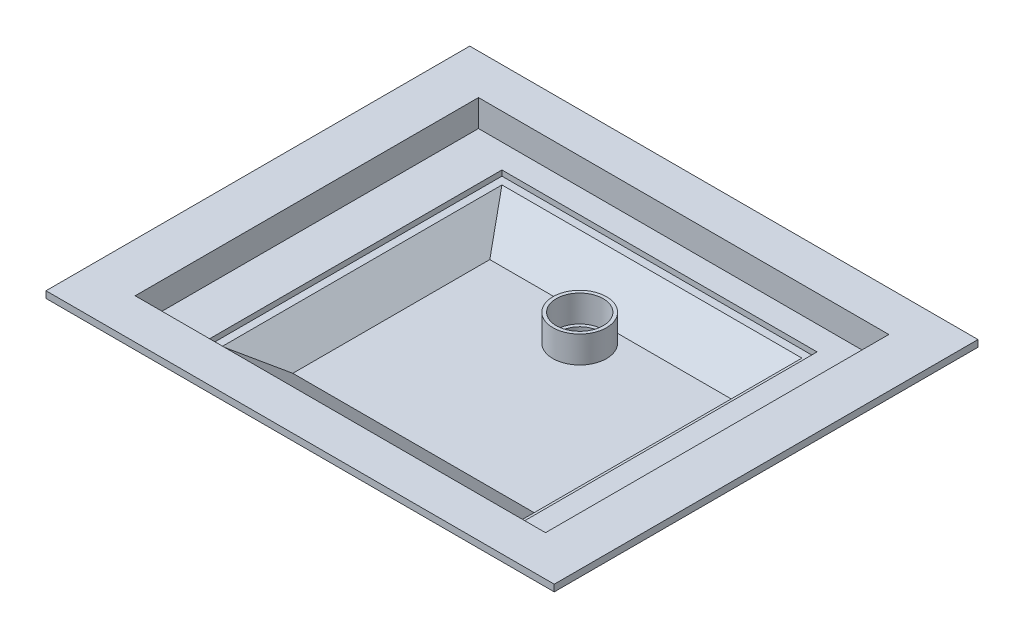
ISO-10303-21;
HEADER;
FILE_DESCRIPTION(('STEP AP214'),'2;1');
FILE_NAME('part.step','',(''),(''),'','','');
FILE_SCHEMA(('AUTOMOTIVE_DESIGN { 1 0 10303 214 1 1 1 1 }'));
ENDSEC;
DATA;
#1=APPLICATION_CONTEXT('core data for automotive mechanical design processes');
#2=APPLICATION_PROTOCOL_DEFINITION('international standard','automotive_design',2000,#1);
#3=PRODUCT_CONTEXT('',#1,'mechanical');
#4=PRODUCT('Part','Part','',(#3));
#5=PRODUCT_RELATED_PRODUCT_CATEGORY('part','',(#4));
#6=PRODUCT_DEFINITION_FORMATION('','',#4);
#7=PRODUCT_DEFINITION_CONTEXT('part definition',#1,'design');
#8=PRODUCT_DEFINITION('design','',#6,#7);
#9=PRODUCT_DEFINITION_SHAPE('','',#8);
#10=(LENGTH_UNIT() NAMED_UNIT(*) SI_UNIT(.MILLI.,.METRE.));
#11=(NAMED_UNIT(*) PLANE_ANGLE_UNIT() SI_UNIT($,.RADIAN.));
#12=(NAMED_UNIT(*) SI_UNIT($,.STERADIAN.) SOLID_ANGLE_UNIT());
#13=UNCERTAINTY_MEASURE_WITH_UNIT(LENGTH_MEASURE(1.E-05),#10,'distance_accuracy_value','');
#14=(GEOMETRIC_REPRESENTATION_CONTEXT(3) GLOBAL_UNCERTAINTY_ASSIGNED_CONTEXT((#13)) GLOBAL_UNIT_ASSIGNED_CONTEXT((#10,
#11,#12)) REPRESENTATION_CONTEXT('',''));
#15=CARTESIAN_POINT('',(0.,0.,0.));
#16=DIRECTION('',(0.,0.,1.));
#17=DIRECTION('',(1.,0.,0.));
#18=AXIS2_PLACEMENT_3D('',#15,#16,#17);
#19=CARTESIAN_POINT('',(-90.0000000000007,-21.8431457505076,-110.));
#20=DIRECTION('',(0.,-1.,0.));
#21=DIRECTION('',(1.,0.,0.));
#22=AXIS2_PLACEMENT_3D('',#19,#20,#21);
#23=PLANE('',#22);
#24=CARTESIAN_POINT('',(-2.49999999999914,-21.8431457505076,-53.));
#25=DIRECTION('',(0.,-1.,0.));
#26=DIRECTION('',(1.,0.,0.));
#27=AXIS2_PLACEMENT_3D('',#24,#25,#26);
#28=CIRCLE('',#27,15.);
#29=CARTESIAN_POINT('',(12.5000000000009,-21.8431457505076,-53.));
#30=VERTEX_POINT('',#29);
#31=EDGE_CURVE('E352',#30,#30,#28,.T.);
#32=ORIENTED_EDGE('',*,*,#31,.T.);
#33=EDGE_LOOP('',(#32));
#34=FACE_BOUND('',#33,.T.);
#35=CARTESIAN_POINT('',(-2.49999999999915,-21.8431457505075,-53.));
#36=DIRECTION('',(0.,1.,0.));
#37=DIRECTION('',(-1.,0.,0.));
#38=AXIS2_PLACEMENT_3D('',#35,#36,#37);
#39=CIRCLE('',#38,17.5);
#40=CARTESIAN_POINT('',(-19.9999999999991,-21.8431457505075,-53.));
#41=VERTEX_POINT('',#40);
#42=EDGE_CURVE('E364',#41,#41,#39,.T.);
#43=ORIENTED_EDGE('',*,*,#42,.T.);
#44=EDGE_LOOP('',(#43));
#45=FACE_BOUND('',#44,.T.);
#46=ADVANCED_FACE('F43',(#34,#45),#23,.F.);
#47=CARTESIAN_POINT('',(-111.843145750508,0.,-110.));
#48=DIRECTION('',(-0.707106781186557,-0.707106781186538,0.));
#49=DIRECTION('',(0.707106781186538,-0.707106781186557,0.));
#50=AXIS2_PLACEMENT_3D('',#47,#48,#49);
#51=PLANE('',#50);
#52=DIRECTION('',(-0.499999999999987,0.500000000000001,-0.707106781186556));
#53=VECTOR('',#52,1.);
#54=CARTESIAN_POINT('',(-113.257859312881,1.41471356237305,-106.340707106781));
#55=LINE('',#54,#53);
#56=CARTESIAN_POINT('',(-90.0000000000007,-21.8431457505076,-73.4491270347397));
#57=VERTEX_POINT('',#56);
#58=CARTESIAN_POINT('',(-111.843145750508,0.,-104.34));
#59=VERTEX_POINT('',#58);
#60=EDGE_CURVE('E154',#57,#59,#55,.T.);
#61=ORIENTED_EDGE('',*,*,#60,.T.);
#62=DIRECTION('',(0.,0.,1.));
#63=VECTOR('',#62,1.);
#64=CARTESIAN_POINT('',(-111.843145750508,0.,-110.));
#65=LINE('',#64,#63);
#66=CARTESIAN_POINT('',(-111.843145750508,0.,104.34));
#67=VERTEX_POINT('',#66);
#68=EDGE_CURVE('E51',#59,#67,#65,.T.);
#69=ORIENTED_EDGE('',*,*,#68,.T.);
#70=DIRECTION('',(0.499999999999997,-0.50000000000001,-0.707106781186543));
#71=VECTOR('',#70,1.);
#72=CARTESIAN_POINT('',(-120.824234064114,8.98108831360659,117.041176897973));
#73=LINE('',#72,#71);
#74=CARTESIAN_POINT('',(-90.0000000000007,-21.8431457505076,73.449127034741));
#75=VERTEX_POINT('',#74);
#76=EDGE_CURVE('E151',#67,#75,#73,.T.);
#77=ORIENTED_EDGE('',*,*,#76,.T.);
#78=DIRECTION('',(0.,0.,1.));
#79=VECTOR('',#78,1.);
#80=CARTESIAN_POINT('',(-90.0000000000007,-21.8431457505076,-110.));
#81=LINE('',#80,#79);
#82=EDGE_CURVE('E146',#57,#75,#81,.T.);
#83=ORIENTED_EDGE('',*,*,#82,.F.);
#84=EDGE_LOOP('',(#61,#69,#77,#83));
#85=FACE_BOUND('',#84,.T.);
#86=ADVANCED_FACE('F45',(#85),#51,.F.);
#87=CARTESIAN_POINT('',(-2.49999999999915,-21.8431457505075,-53.));
#88=DIRECTION('',(0.,-1.,0.));
#89=DIRECTION('',(1.,0.,0.));
#90=AXIS2_PLACEMENT_3D('',#87,#88,#89);
#91=CIRCLE('',#90,20.);
#92=CARTESIAN_POINT('',(17.5000000000009,-21.8431457505075,-53.));
#93=VERTEX_POINT('',#92);
#94=EDGE_CURVE('E12',#93,#93,#91,.F.);
#95=ORIENTED_EDGE('',*,*,#94,.F.);
#96=EDGE_LOOP('',(#95));
#97=FACE_BOUND('',#96,.T.);
#98=DIRECTION('',(1.,0.,0.));
#99=VECTOR('',#98,1.);
#100=CARTESIAN_POINT('',(-139.345145750508,-21.8431457505075,-73.4491270347397));
#101=LINE('',#100,#99);
#102=CARTESIAN_POINT('',(89.9999999999994,-21.8431457505075,-73.4491270347397));
#103=VERTEX_POINT('',#102);
#104=EDGE_CURVE('E58',#57,#103,#101,.T.);
#105=ORIENTED_EDGE('',*,*,#104,.F.);
#106=ORIENTED_EDGE('',*,*,#82,.T.);
#107=DIRECTION('',(1.,0.,0.));
#108=VECTOR('',#107,1.);
#109=CARTESIAN_POINT('',(-169.610644755442,-21.8431457505075,73.4491270347409));
#110=LINE('',#109,#108);
#111=CARTESIAN_POINT('',(89.9999999999994,-21.8431457505075,73.449127034741));
#112=VERTEX_POINT('',#111);
#113=EDGE_CURVE('E165',#75,#112,#110,.T.);
#114=ORIENTED_EDGE('',*,*,#113,.T.);
#115=DIRECTION('',(0.,0.,1.));
#116=VECTOR('',#115,1.);
#117=CARTESIAN_POINT('',(89.9999999999994,-21.8431457505075,-110.));
#118=LINE('',#117,#116);
#119=EDGE_CURVE('E144',#103,#112,#118,.T.);
#120=ORIENTED_EDGE('',*,*,#119,.F.);
#121=EDGE_LOOP('',(#105,#106,#114,#120));
#122=FACE_BOUND('',#121,.T.);
#123=ADVANCED_FACE('F199',(#97,#122),#23,.F.);
#124=CARTESIAN_POINT('',(89.9999999999994,-21.8431457505075,-110.));
#125=DIRECTION('',(0.707106781186538,-0.707106781186557,0.));
#126=DIRECTION('',(0.707106781186557,0.707106781186538,0.));
#127=AXIS2_PLACEMENT_3D('',#124,#125,#126);
#128=PLANE('',#127);
#129=DIRECTION('',(0.500000000000007,0.499999999999994,-0.707106781186547));
#130=VECTOR('',#129,1.);
#131=CARTESIAN_POINT('',(111.843145750508,0.,-104.34));
#132=LINE('',#131,#130);
#133=CARTESIAN_POINT('',(111.843145750508,0.,-104.34));
#134=VERTEX_POINT('',#133);
#135=EDGE_CURVE('E66',#103,#134,#132,.T.);
#136=ORIENTED_EDGE('',*,*,#135,.F.);
#137=ORIENTED_EDGE('',*,*,#119,.T.);
#138=DIRECTION('',(-0.500000000000017,-0.500000000000004,-0.707106781186533));
#139=VECTOR('',#138,1.);
#140=CARTESIAN_POINT('',(111.843145750508,0.,104.34));
#141=LINE('',#140,#139);
#142=CARTESIAN_POINT('',(111.843145750508,0.,104.34));
#143=VERTEX_POINT('',#142);
#144=EDGE_CURVE('E171',#143,#112,#141,.T.);
#145=ORIENTED_EDGE('',*,*,#144,.F.);
#146=DIRECTION('',(0.,0.,1.));
#147=VECTOR('',#146,1.);
#148=CARTESIAN_POINT('',(111.843145750508,0.,-110.));
#149=LINE('',#148,#147);
#150=EDGE_CURVE('E142',#134,#143,#149,.T.);
#151=ORIENTED_EDGE('',*,*,#150,.F.);
#152=EDGE_LOOP('',(#136,#137,#145,#151));
#153=FACE_BOUND('',#152,.T.);
#154=ADVANCED_FACE('F207',(#153),#128,.F.);
#155=CARTESIAN_POINT('',(111.843145750508,0.,-110.));
#156=DIRECTION('',(0.,-1.,0.));
#157=DIRECTION('',(0.,0.,-1.));
#158=AXIS2_PLACEMENT_3D('',#155,#156,#157);
#159=PLANE('',#158);
#160=ORIENTED_EDGE('',*,*,#68,.F.);
#161=DIRECTION('',(1.,0.,0.));
#162=VECTOR('',#161,1.);
#163=CARTESIAN_POINT('',(-117.502,0.,-104.34));
#164=LINE('',#163,#162);
#165=EDGE_CURVE('E362',#59,#134,#164,.T.);
#166=ORIENTED_EDGE('',*,*,#165,.T.);
#167=ORIENTED_EDGE('',*,*,#150,.T.);
#168=DIRECTION('',(1.,0.,0.));
#169=VECTOR('',#168,1.);
#170=CARTESIAN_POINT('',(-147.767499004934,0.,104.34));
#171=LINE('',#170,#169);
#172=EDGE_CURVE('E163',#67,#143,#171,.T.);
#173=ORIENTED_EDGE('',*,*,#172,.F.);
#174=EDGE_LOOP('',(#160,#166,#167,#173));
#175=FACE_BOUND('',#174,.T.);
#176=DIRECTION('',(1.,0.,0.));
#177=VECTOR('',#176,1.);
#178=CARTESIAN_POINT('',(111.843145750508,0.,110.));
#179=LINE('',#178,#177);
#180=CARTESIAN_POINT('',(-117.5,0.,110.));
#181=VERTEX_POINT('',#180);
#182=CARTESIAN_POINT('',(117.5,0.,110.));
#183=VERTEX_POINT('',#182);
#184=EDGE_CURVE('E182',#181,#183,#179,.T.);
#185=ORIENTED_EDGE('',*,*,#184,.T.);
#186=DIRECTION('',(0.,0.,1.));
#187=VECTOR('',#186,1.);
#188=CARTESIAN_POINT('',(117.5,0.,-110.));
#189=LINE('',#188,#187);
#190=CARTESIAN_POINT('',(117.5,0.,-110.));
#191=VERTEX_POINT('',#190);
#192=EDGE_CURVE('E134',#191,#183,#189,.T.);
#193=ORIENTED_EDGE('',*,*,#192,.F.);
#194=DIRECTION('',(1.,0.,0.));
#195=VECTOR('',#194,1.);
#196=CARTESIAN_POINT('',(-117.5,0.,-110.));
#197=LINE('',#196,#195);
#198=CARTESIAN_POINT('',(-117.5,0.,-110.));
#199=VERTEX_POINT('',#198);
#200=EDGE_CURVE('E136',#199,#191,#197,.T.);
#201=ORIENTED_EDGE('',*,*,#200,.F.);
#202=DIRECTION('',(0.,0.,1.));
#203=VECTOR('',#202,1.);
#204=CARTESIAN_POINT('',(-117.5,0.,-110.));
#205=LINE('',#204,#203);
#206=EDGE_CURVE('E126',#199,#181,#205,.T.);
#207=ORIENTED_EDGE('',*,*,#206,.T.);
#208=EDGE_LOOP('',(#185,#193,#201,#207));
#209=FACE_BOUND('',#208,.T.);
#210=ADVANCED_FACE('F168',(#175,#209),#159,.F.);
#211=CARTESIAN_POINT('',(117.5,0.,-110.));
#212=DIRECTION('',(-0.707106781186538,0.707106781186557,0.));
#213=DIRECTION('',(-0.707106781186557,-0.707106781186538,0.));
#214=AXIS2_PLACEMENT_3D('',#211,#212,#213);
#215=PLANE('',#214);
#216=DIRECTION('',(0.,0.,1.));
#217=VECTOR('',#216,1.);
#218=CARTESIAN_POINT('',(91.6568542494918,-25.8431457505075,-110.));
#219=LINE('',#218,#217);
#220=CARTESIAN_POINT('',(91.6568542494918,-25.8431457505075,-73.4522727852473));
#221=VERTEX_POINT('',#220);
#222=CARTESIAN_POINT('',(91.6568542494918,-25.8431457505075,73.4522727852489));
#223=VERTEX_POINT('',#222);
#224=EDGE_CURVE('E132',#221,#223,#219,.T.);
#225=ORIENTED_EDGE('',*,*,#224,.F.);
#226=DIRECTION('',(0.500000000000007,0.499999999999994,-0.707106781186546));
#227=VECTOR('',#226,1.);
#228=CARTESIAN_POINT('',(117.5,0.,-110.));
#229=LINE('',#228,#227);
#230=EDGE_CURVE('E113',#221,#191,#229,.T.);
#231=ORIENTED_EDGE('',*,*,#230,.T.);
#232=ORIENTED_EDGE('',*,*,#192,.T.);
#233=DIRECTION('',(-0.500000000000018,-0.500000000000004,-0.707106781186532));
#234=VECTOR('',#233,1.);
#235=CARTESIAN_POINT('',(39.7182540694787,-77.7817459305192,4.91273688396632E-12));
#236=LINE('',#235,#234);
#237=EDGE_CURVE('E118',#183,#223,#236,.T.);
#238=ORIENTED_EDGE('',*,*,#237,.T.);
#239=EDGE_LOOP('',(#225,#231,#232,#238));
#240=FACE_BOUND('',#239,.T.);
#241=ADVANCED_FACE('F187',(#240),#215,.F.);
#242=CARTESIAN_POINT('',(-91.6568542494932,-25.8431457505075,-110.));
#243=DIRECTION('',(0.,1.,0.));
#244=DIRECTION('',(-1.,0.,0.));
#245=AXIS2_PLACEMENT_3D('',#242,#243,#244);
#246=PLANE('',#245);
#247=CARTESIAN_POINT('',(-2.49999999999914,-25.8431457505075,-53.));
#248=DIRECTION('',(0.,-1.,0.));
#249=DIRECTION('',(1.,0.,0.));
#250=AXIS2_PLACEMENT_3D('',#247,#248,#249);
#251=CIRCLE('',#250,15.);
#252=CARTESIAN_POINT('',(12.5000000000009,-25.8431457505075,-53.));
#253=VERTEX_POINT('',#252);
#254=EDGE_CURVE('E351',#253,#253,#251,.T.);
#255=ORIENTED_EDGE('',*,*,#254,.F.);
#256=EDGE_LOOP('',(#255));
#257=FACE_BOUND('',#256,.T.);
#258=DIRECTION('',(0.,0.,1.));
#259=VECTOR('',#258,1.);
#260=CARTESIAN_POINT('',(-91.6568542494932,-25.8431457505075,-110.));
#261=LINE('',#260,#259);
#262=CARTESIAN_POINT('',(-91.6568542494933,-25.8431457505075,-73.4522727852473));
#263=VERTEX_POINT('',#262);
#264=CARTESIAN_POINT('',(-91.6568542494932,-25.8431457505075,73.4522727852489));
#265=VERTEX_POINT('',#264);
#266=EDGE_CURVE('E124',#263,#265,#261,.T.);
#267=ORIENTED_EDGE('',*,*,#266,.F.);
#268=DIRECTION('',(-1.,0.,0.));
#269=VECTOR('',#268,1.);
#270=CARTESIAN_POINT('',(721.343145750507,-25.8431457505075,-73.4522727852473));
#271=LINE('',#270,#269);
#272=EDGE_CURVE('E107',#221,#263,#271,.T.);
#273=ORIENTED_EDGE('',*,*,#272,.F.);
#274=ORIENTED_EDGE('',*,*,#224,.T.);
#275=DIRECTION('',(-1.,0.,0.));
#276=VECTOR('',#275,1.);
#277=CARTESIAN_POINT('',(721.343145750507,-25.8431457505075,73.4522727852489));
#278=LINE('',#277,#276);
#279=EDGE_CURVE('E128',#223,#265,#278,.T.);
#280=ORIENTED_EDGE('',*,*,#279,.T.);
#281=EDGE_LOOP('',(#267,#273,#274,#280));
#282=FACE_BOUND('',#281,.T.);
#283=ADVANCED_FACE('F131',(#257,#282),#246,.F.);
#284=CARTESIAN_POINT('',(-117.5,0.,-110.));
#285=DIRECTION('',(0.707106781186557,0.707106781186538,0.));
#286=DIRECTION('',(-0.707106781186538,0.707106781186557,0.));
#287=AXIS2_PLACEMENT_3D('',#284,#285,#286);
#288=PLANE('',#287);
#289=ORIENTED_EDGE('',*,*,#206,.F.);
#290=DIRECTION('',(-0.499999999999987,0.500000000000001,-0.707106781186556));
#291=VECTOR('',#290,1.);
#292=CARTESIAN_POINT('',(-117.5,0.,-110.));
#293=LINE('',#292,#291);
#294=EDGE_CURVE('E110',#263,#199,#293,.T.);
#295=ORIENTED_EDGE('',*,*,#294,.F.);
#296=ORIENTED_EDGE('',*,*,#266,.T.);
#297=DIRECTION('',(0.499999999999998,-0.500000000000011,-0.707106781186541));
#298=VECTOR('',#297,1.);
#299=CARTESIAN_POINT('',(-117.5,0.,110.));
#300=LINE('',#299,#298);
#301=EDGE_CURVE('E166',#181,#265,#300,.T.);
#302=ORIENTED_EDGE('',*,*,#301,.F.);
#303=EDGE_LOOP('',(#289,#295,#296,#302));
#304=FACE_BOUND('',#303,.T.);
#305=ADVANCED_FACE('F122',(#304),#288,.F.);
#306=CARTESIAN_POINT('',(695.5,0.,110.));
#307=DIRECTION('',(0.,0.816496580927718,-0.577350269189638));
#308=DIRECTION('',(0.,0.577350269189638,0.816496580927718));
#309=AXIS2_PLACEMENT_3D('',#306,#307,#308);
#310=PLANE('',#309);
#311=ORIENTED_EDGE('',*,*,#184,.F.);
#312=ORIENTED_EDGE('',*,*,#301,.T.);
#313=ORIENTED_EDGE('',*,*,#279,.F.);
#314=ORIENTED_EDGE('',*,*,#237,.F.);
#315=EDGE_LOOP('',(#311,#312,#313,#314));
#316=FACE_BOUND('',#315,.T.);
#317=ADVANCED_FACE('F188',(#316),#310,.F.);
#318=CARTESIAN_POINT('',(695.5,0.,-110.));
#319=DIRECTION('',(0.,0.816496580927729,0.577350269189622));
#320=DIRECTION('',(0.,-0.577350269189622,0.816496580927729));
#321=AXIS2_PLACEMENT_3D('',#318,#319,#320);
#322=PLANE('',#321);
#323=ORIENTED_EDGE('',*,*,#200,.T.);
#324=ORIENTED_EDGE('',*,*,#230,.F.);
#325=ORIENTED_EDGE('',*,*,#272,.T.);
#326=ORIENTED_EDGE('',*,*,#294,.T.);
#327=EDGE_LOOP('',(#323,#324,#325,#326));
#328=FACE_BOUND('',#327,.T.);
#329=ADVANCED_FACE('F109',(#328),#322,.F.);
#330=CARTESIAN_POINT('',(-147.767499004934,0.,104.34));
#331=DIRECTION('',(0.,-0.816496580927718,0.577350269189637));
#332=DIRECTION('',(0.,-0.577350269189637,-0.816496580927718));
#333=AXIS2_PLACEMENT_3D('',#330,#331,#332);
#334=PLANE('',#333);
#335=ORIENTED_EDGE('',*,*,#76,.F.);
#336=ORIENTED_EDGE('',*,*,#172,.T.);
#337=ORIENTED_EDGE('',*,*,#144,.T.);
#338=ORIENTED_EDGE('',*,*,#113,.F.);
#339=EDGE_LOOP('',(#335,#336,#337,#338));
#340=FACE_BOUND('',#339,.T.);
#341=ADVANCED_FACE('F161',(#340),#334,.F.);
#342=CARTESIAN_POINT('',(-117.502,0.,-104.34));
#343=DIRECTION('',(0.,-0.816496580927729,-0.577350269189621));
#344=DIRECTION('',(0.,0.577350269189622,-0.816496580927729));
#345=AXIS2_PLACEMENT_3D('',#342,#343,#344);
#346=PLANE('',#345);
#347=ORIENTED_EDGE('',*,*,#60,.F.);
#348=ORIENTED_EDGE('',*,*,#104,.T.);
#349=ORIENTED_EDGE('',*,*,#135,.T.);
#350=ORIENTED_EDGE('',*,*,#165,.F.);
#351=EDGE_LOOP('',(#347,#348,#349,#350));
#352=FACE_BOUND('',#351,.T.);
#353=ADVANCED_FACE('F233',(#352),#346,.F.);
#354=CARTESIAN_POINT('',(-2.49999999999907,797.156854249493,-53.));
#355=DIRECTION('',(0.,-1.,0.));
#356=DIRECTION('',(1.,0.,0.));
#357=AXIS2_PLACEMENT_3D('',#354,#355,#356);
#358=CYLINDRICAL_SURFACE('',#357,15.);
#359=ORIENTED_EDGE('',*,*,#254,.T.);
#360=EDGE_LOOP('',(#359));
#361=FACE_BOUND('',#360,.T.);
#362=ORIENTED_EDGE('',*,*,#31,.F.);
#363=EDGE_LOOP('',(#362));
#364=FACE_BOUND('',#363,.T.);
#365=ADVANCED_FACE('F226',(#361,#364),#358,.F.);
#366=CARTESIAN_POINT('',(-2.49999999999915,-1.84314575050753,-53.));
#367=DIRECTION('',(0.,1.,0.));
#368=DIRECTION('',(-1.,0.,0.));
#369=AXIS2_PLACEMENT_3D('',#366,#367,#368);
#370=PLANE('',#369);
#371=CARTESIAN_POINT('',(-2.49999999999915,-1.84314575050753,-53.));
#372=DIRECTION('',(0.,1.,0.));
#373=DIRECTION('',(-1.,0.,0.));
#374=AXIS2_PLACEMENT_3D('',#371,#372,#373);
#375=CIRCLE('',#374,20.);
#376=CARTESIAN_POINT('',(-22.4999999999992,-1.84314575050753,-53.));
#377=VERTEX_POINT('',#376);
#378=EDGE_CURVE('E353',#377,#377,#375,.T.);
#379=ORIENTED_EDGE('',*,*,#378,.T.);
#380=EDGE_LOOP('',(#379));
#381=FACE_BOUND('',#380,.T.);
#382=CARTESIAN_POINT('',(-2.49999999999915,-1.84314575050753,-53.));
#383=DIRECTION('',(0.,1.,0.));
#384=DIRECTION('',(-1.,0.,0.));
#385=AXIS2_PLACEMENT_3D('',#382,#383,#384);
#386=CIRCLE('',#385,17.5);
#387=CARTESIAN_POINT('',(-19.9999999999992,-1.84314575050753,-53.));
#388=VERTEX_POINT('',#387);
#389=EDGE_CURVE('E357',#388,#388,#386,.T.);
#390=ORIENTED_EDGE('',*,*,#389,.F.);
#391=EDGE_LOOP('',(#390));
#392=FACE_BOUND('',#391,.T.);
#393=ADVANCED_FACE('F217',(#381,#392),#370,.T.);
#394=CARTESIAN_POINT('',(-2.49999999999915,-1.84314575050753,-53.));
#395=DIRECTION('',(0.,-1.,0.));
#396=DIRECTION('',(1.,0.,0.));
#397=AXIS2_PLACEMENT_3D('',#394,#395,#396);
#398=CYLINDRICAL_SURFACE('',#397,20.);
#399=ORIENTED_EDGE('',*,*,#378,.F.);
#400=EDGE_LOOP('',(#399));
#401=FACE_BOUND('',#400,.T.);
#402=ORIENTED_EDGE('',*,*,#94,.T.);
#403=EDGE_LOOP('',(#402));
#404=FACE_BOUND('',#403,.T.);
#405=ADVANCED_FACE('F214',(#401,#404),#398,.T.);
#406=CARTESIAN_POINT('',(-2.49999999999915,-1.84314575050753,-53.));
#407=DIRECTION('',(0.,-1.,0.));
#408=DIRECTION('',(1.,0.,0.));
#409=AXIS2_PLACEMENT_3D('',#406,#407,#408);
#410=CYLINDRICAL_SURFACE('',#409,17.5);
#411=ORIENTED_EDGE('',*,*,#389,.T.);
#412=EDGE_LOOP('',(#411));
#413=FACE_BOUND('',#412,.T.);
#414=ORIENTED_EDGE('',*,*,#42,.F.);
#415=EDGE_LOOP('',(#414));
#416=FACE_BOUND('',#415,.T.);
#417=ADVANCED_FACE('F216',(#413,#416),#410,.F.);
#418=CLOSED_SHELL('',(#46,#86,#123,#154,#210,#241,#283,#305,#317,#329,#341,#353,#365,#393,#405,#417));
#419=MANIFOLD_SOLID_BREP('B2',#418);
#420=CARTESIAN_POINT('',(157.,24.,132.));
#421=DIRECTION('',(-1.,0.,0.));
#422=DIRECTION('',(0.,0.,1.));
#423=AXIS2_PLACEMENT_3D('',#420,#421,#422);
#424=PLANE('',#423);
#425=DIRECTION('',(0.,0.,-1.));
#426=VECTOR('',#425,1.);
#427=CARTESIAN_POINT('',(157.,19.,-132.));
#428=LINE('',#427,#426);
#429=CARTESIAN_POINT('',(157.,19.,132.));
#430=VERTEX_POINT('',#429);
#431=CARTESIAN_POINT('',(157.,19.,-132.));
#432=VERTEX_POINT('',#431);
#433=EDGE_CURVE('E501',#430,#432,#428,.T.);
#434=ORIENTED_EDGE('',*,*,#433,.F.);
#435=DIRECTION('',(0.,-1.,0.));
#436=VECTOR('',#435,1.);
#437=CARTESIAN_POINT('',(157.,24.,132.));
#438=LINE('',#437,#436);
#439=CARTESIAN_POINT('',(157.,0.,132.));
#440=VERTEX_POINT('',#439);
#441=EDGE_CURVE('E488',#430,#440,#438,.T.);
#442=ORIENTED_EDGE('',*,*,#441,.T.);
#443=DIRECTION('',(0.,0.,-1.));
#444=VECTOR('',#443,1.);
#445=CARTESIAN_POINT('',(157.,0.,132.));
#446=LINE('',#445,#444);
#447=CARTESIAN_POINT('',(157.,0.,-132.));
#448=VERTEX_POINT('',#447);
#449=EDGE_CURVE('E589',#440,#448,#446,.T.);
#450=ORIENTED_EDGE('',*,*,#449,.T.);
#451=DIRECTION('',(0.,-1.,0.));
#452=VECTOR('',#451,1.);
#453=CARTESIAN_POINT('',(157.,24.,-132.));
#454=LINE('',#453,#452);
#455=EDGE_CURVE('E502',#432,#448,#454,.T.);
#456=ORIENTED_EDGE('',*,*,#455,.F.);
#457=EDGE_LOOP('',(#434,#442,#450,#456));
#458=FACE_BOUND('',#457,.T.);
#459=ADVANCED_FACE('F377',(#458),#424,.F.);
#460=CARTESIAN_POINT('',(-157.,24.,-132.));
#461=DIRECTION('',(0.,0.,1.));
#462=DIRECTION('',(1.,0.,0.));
#463=AXIS2_PLACEMENT_3D('',#460,#461,#462);
#464=PLANE('',#463);
#465=DIRECTION('',(-1.,0.,0.));
#466=VECTOR('',#465,1.);
#467=CARTESIAN_POINT('',(-157.,19.,-132.));
#468=LINE('',#467,#466);
#469=CARTESIAN_POINT('',(-157.,19.,-132.));
#470=VERTEX_POINT('',#469);
#471=EDGE_CURVE('E391',#432,#470,#468,.T.);
#472=ORIENTED_EDGE('',*,*,#471,.F.);
#473=ORIENTED_EDGE('',*,*,#455,.T.);
#474=DIRECTION('',(-1.,0.,0.));
#475=VECTOR('',#474,1.);
#476=CARTESIAN_POINT('',(-157.,0.,-132.));
#477=LINE('',#476,#475);
#478=CARTESIAN_POINT('',(-157.,0.,-132.));
#479=VERTEX_POINT('',#478);
#480=EDGE_CURVE('E597',#448,#479,#477,.T.);
#481=ORIENTED_EDGE('',*,*,#480,.T.);
#482=DIRECTION('',(0.,-1.,0.));
#483=VECTOR('',#482,1.);
#484=CARTESIAN_POINT('',(-157.,24.,-132.));
#485=LINE('',#484,#483);
#486=EDGE_CURVE('E605',#470,#479,#485,.T.);
#487=ORIENTED_EDGE('',*,*,#486,.F.);
#488=EDGE_LOOP('',(#472,#473,#481,#487));
#489=FACE_BOUND('',#488,.T.);
#490=ADVANCED_FACE('F651',(#489),#464,.F.);
#491=CARTESIAN_POINT('',(-157.,24.,132.));
#492=DIRECTION('',(1.,0.,0.));
#493=DIRECTION('',(0.,0.,-1.));
#494=AXIS2_PLACEMENT_3D('',#491,#492,#493);
#495=PLANE('',#494);
#496=DIRECTION('',(0.,0.,1.));
#497=VECTOR('',#496,1.);
#498=CARTESIAN_POINT('',(-157.,19.,-132.));
#499=LINE('',#498,#497);
#500=CARTESIAN_POINT('',(-157.,19.,132.));
#501=VERTEX_POINT('',#500);
#502=EDGE_CURVE('E399',#470,#501,#499,.T.);
#503=ORIENTED_EDGE('',*,*,#502,.F.);
#504=ORIENTED_EDGE('',*,*,#486,.T.);
#505=DIRECTION('',(0.,0.,1.));
#506=VECTOR('',#505,1.);
#507=CARTESIAN_POINT('',(-157.,0.,132.));
#508=LINE('',#507,#506);
#509=CARTESIAN_POINT('',(-157.,0.,132.));
#510=VERTEX_POINT('',#509);
#511=EDGE_CURVE('E600',#479,#510,#508,.T.);
#512=ORIENTED_EDGE('',*,*,#511,.T.);
#513=DIRECTION('',(0.,-1.,0.));
#514=VECTOR('',#513,1.);
#515=CARTESIAN_POINT('',(-157.,24.,132.));
#516=LINE('',#515,#514);
#517=EDGE_CURVE('E498',#501,#510,#516,.T.);
#518=ORIENTED_EDGE('',*,*,#517,.F.);
#519=EDGE_LOOP('',(#503,#504,#512,#518));
#520=FACE_BOUND('',#519,.T.);
#521=ADVANCED_FACE('F646',(#520),#495,.F.);
#522=CARTESIAN_POINT('',(-157.,24.,132.));
#523=DIRECTION('',(0.,0.,-1.));
#524=DIRECTION('',(-1.,0.,0.));
#525=AXIS2_PLACEMENT_3D('',#522,#523,#524);
#526=PLANE('',#525);
#527=DIRECTION('',(1.,0.,0.));
#528=VECTOR('',#527,1.);
#529=CARTESIAN_POINT('',(-157.,19.,132.));
#530=LINE('',#529,#528);
#531=EDGE_CURVE('E492',#501,#430,#530,.T.);
#532=ORIENTED_EDGE('',*,*,#531,.F.);
#533=ORIENTED_EDGE('',*,*,#517,.T.);
#534=DIRECTION('',(1.,0.,0.));
#535=VECTOR('',#534,1.);
#536=CARTESIAN_POINT('',(-157.,0.,132.));
#537=LINE('',#536,#535);
#538=EDGE_CURVE('E494',#510,#440,#537,.T.);
#539=ORIENTED_EDGE('',*,*,#538,.T.);
#540=ORIENTED_EDGE('',*,*,#441,.F.);
#541=EDGE_LOOP('',(#532,#533,#539,#540));
#542=FACE_BOUND('',#541,.T.);
#543=ADVANCED_FACE('F490',(#542),#526,.F.);
#544=CARTESIAN_POINT('',(0.,4.,0.));
#545=DIRECTION('',(0.,-1.,0.));
#546=DIRECTION('',(0.,0.,-1.));
#547=AXIS2_PLACEMENT_3D('',#544,#545,#546);
#548=PLANE('',#547);
#549=DIRECTION('',(0.,0.,-1.));
#550=VECTOR('',#549,1.);
#551=CARTESIAN_POINT('',(153.,4.,128.));
#552=LINE('',#551,#550);
#553=CARTESIAN_POINT('',(153.,4.,128.));
#554=VERTEX_POINT('',#553);
#555=CARTESIAN_POINT('',(153.,4.,-128.));
#556=VERTEX_POINT('',#555);
#557=EDGE_CURVE('E564',#554,#556,#552,.T.);
#558=ORIENTED_EDGE('',*,*,#557,.T.);
#559=DIRECTION('',(-1.,0.,0.));
#560=VECTOR('',#559,1.);
#561=CARTESIAN_POINT('',(-153.,4.,-128.));
#562=LINE('',#561,#560);
#563=CARTESIAN_POINT('',(-153.,4.,-128.));
#564=VERTEX_POINT('',#563);
#565=EDGE_CURVE('E567',#556,#564,#562,.T.);
#566=ORIENTED_EDGE('',*,*,#565,.T.);
#567=DIRECTION('',(0.,0.,1.));
#568=VECTOR('',#567,1.);
#569=CARTESIAN_POINT('',(-153.,4.,128.));
#570=LINE('',#569,#568);
#571=CARTESIAN_POINT('',(-153.,4.,128.));
#572=VERTEX_POINT('',#571);
#573=EDGE_CURVE('E571',#564,#572,#570,.T.);
#574=ORIENTED_EDGE('',*,*,#573,.T.);
#575=DIRECTION('',(1.,0.,0.));
#576=VECTOR('',#575,1.);
#577=CARTESIAN_POINT('',(-153.,4.,128.));
#578=LINE('',#577,#576);
#579=EDGE_CURVE('E574',#572,#554,#578,.T.);
#580=ORIENTED_EDGE('',*,*,#579,.T.);
#581=EDGE_LOOP('',(#558,#566,#574,#580));
#582=FACE_BOUND('',#581,.T.);
#583=DIRECTION('',(0.,0.,-1.));
#584=VECTOR('',#583,1.);
#585=CARTESIAN_POINT('',(117.5,4.,110.));
#586=LINE('',#585,#584);
#587=CARTESIAN_POINT('',(117.5,4.,110.));
#588=VERTEX_POINT('',#587);
#589=CARTESIAN_POINT('',(117.5,4.,-110.));
#590=VERTEX_POINT('',#589);
#591=EDGE_CURVE('E538',#588,#590,#586,.T.);
#592=ORIENTED_EDGE('',*,*,#591,.F.);
#593=DIRECTION('',(1.,0.,0.));
#594=VECTOR('',#593,1.);
#595=CARTESIAN_POINT('',(-117.5,4.,110.));
#596=LINE('',#595,#594);
#597=CARTESIAN_POINT('',(-117.5,4.,110.));
#598=VERTEX_POINT('',#597);
#599=EDGE_CURVE('E551',#598,#588,#596,.T.);
#600=ORIENTED_EDGE('',*,*,#599,.F.);
#601=DIRECTION('',(0.,0.,1.));
#602=VECTOR('',#601,1.);
#603=CARTESIAN_POINT('',(-117.5,4.,110.));
#604=LINE('',#603,#602);
#605=CARTESIAN_POINT('',(-117.5,4.,-110.));
#606=VERTEX_POINT('',#605);
#607=EDGE_CURVE('E549',#606,#598,#604,.T.);
#608=ORIENTED_EDGE('',*,*,#607,.F.);
#609=DIRECTION('',(-1.,0.,0.));
#610=VECTOR('',#609,1.);
#611=CARTESIAN_POINT('',(-117.5,4.,-110.));
#612=LINE('',#611,#610);
#613=EDGE_CURVE('E546',#590,#606,#612,.T.);
#614=ORIENTED_EDGE('',*,*,#613,.F.);
#615=EDGE_LOOP('',(#592,#600,#608,#614));
#616=FACE_BOUND('',#615,.T.);
#617=ADVANCED_FACE('F635',(#582,#616),#548,.F.);
#618=CARTESIAN_POINT('',(0.,24.,0.));
#619=DIRECTION('',(0.,-1.,0.));
#620=DIRECTION('',(0.,0.,-1.));
#621=AXIS2_PLACEMENT_3D('',#618,#619,#620);
#622=PLANE('',#621);
#623=DIRECTION('',(-1.,0.,0.));
#624=VECTOR('',#623,1.);
#625=CARTESIAN_POINT('',(-153.,24.,-128.));
#626=LINE('',#625,#624);
#627=CARTESIAN_POINT('',(153.,24.,-128.));
#628=VERTEX_POINT('',#627);
#629=CARTESIAN_POINT('',(-153.,24.,-128.));
#630=VERTEX_POINT('',#629);
#631=EDGE_CURVE('E579',#628,#630,#626,.T.);
#632=ORIENTED_EDGE('',*,*,#631,.F.);
#633=DIRECTION('',(0.,0.,-1.));
#634=VECTOR('',#633,1.);
#635=CARTESIAN_POINT('',(153.,24.,128.));
#636=LINE('',#635,#634);
#637=CARTESIAN_POINT('',(153.,24.,128.));
#638=VERTEX_POINT('',#637);
#639=EDGE_CURVE('E557',#638,#628,#636,.T.);
#640=ORIENTED_EDGE('',*,*,#639,.F.);
#641=DIRECTION('',(1.,0.,0.));
#642=VECTOR('',#641,1.);
#643=CARTESIAN_POINT('',(-153.,24.,128.));
#644=LINE('',#643,#642);
#645=CARTESIAN_POINT('',(-153.,24.,128.));
#646=VERTEX_POINT('',#645);
#647=EDGE_CURVE('E568',#646,#638,#644,.T.);
#648=ORIENTED_EDGE('',*,*,#647,.F.);
#649=DIRECTION('',(0.,0.,1.));
#650=VECTOR('',#649,1.);
#651=CARTESIAN_POINT('',(-153.,24.,128.));
#652=LINE('',#651,#650);
#653=EDGE_CURVE('E582',#630,#646,#652,.T.);
#654=ORIENTED_EDGE('',*,*,#653,.F.);
#655=EDGE_LOOP('',(#632,#640,#648,#654));
#656=FACE_BOUND('',#655,.T.);
#657=DIRECTION('',(0.,0.,-1.));
#658=VECTOR('',#657,1.);
#659=CARTESIAN_POINT('',(189.5,24.,-158.));
#660=LINE('',#659,#658);
#661=CARTESIAN_POINT('',(189.5,24.,158.));
#662=VERTEX_POINT('',#661);
#663=CARTESIAN_POINT('',(189.5,24.,-158.));
#664=VERTEX_POINT('',#663);
#665=EDGE_CURVE('E507',#662,#664,#660,.T.);
#666=ORIENTED_EDGE('',*,*,#665,.T.);
#667=DIRECTION('',(-1.,0.,0.));
#668=VECTOR('',#667,1.);
#669=CARTESIAN_POINT('',(-189.5,24.,-158.));
#670=LINE('',#669,#668);
#671=CARTESIAN_POINT('',(-189.5,24.,-158.));
#672=VERTEX_POINT('',#671);
#673=EDGE_CURVE('E510',#664,#672,#670,.T.);
#674=ORIENTED_EDGE('',*,*,#673,.T.);
#675=DIRECTION('',(0.,0.,1.));
#676=VECTOR('',#675,1.);
#677=CARTESIAN_POINT('',(-189.5,24.,-158.));
#678=LINE('',#677,#676);
#679=CARTESIAN_POINT('',(-189.5,24.,158.));
#680=VERTEX_POINT('',#679);
#681=EDGE_CURVE('E531',#672,#680,#678,.T.);
#682=ORIENTED_EDGE('',*,*,#681,.T.);
#683=DIRECTION('',(1.,0.,0.));
#684=VECTOR('',#683,1.);
#685=CARTESIAN_POINT('',(-189.5,24.,158.));
#686=LINE('',#685,#684);
#687=EDGE_CURVE('E519',#680,#662,#686,.T.);
#688=ORIENTED_EDGE('',*,*,#687,.T.);
#689=EDGE_LOOP('',(#666,#674,#682,#688));
#690=FACE_BOUND('',#689,.T.);
#691=ADVANCED_FACE('F637',(#656,#690),#622,.F.);
#692=CARTESIAN_POINT('',(0.,0.,0.));
#693=DIRECTION('',(0.,-1.,0.));
#694=DIRECTION('',(0.,0.,-1.));
#695=AXIS2_PLACEMENT_3D('',#692,#693,#694);
#696=PLANE('',#695);
#697=DIRECTION('',(0.,0.,1.));
#698=VECTOR('',#697,1.);
#699=CARTESIAN_POINT('',(117.5,0.,0.));
#700=LINE('',#699,#698);
#701=CARTESIAN_POINT('',(117.5,0.,-110.));
#702=VERTEX_POINT('',#701);
#703=CARTESIAN_POINT('',(117.5,0.,110.));
#704=VERTEX_POINT('',#703);
#705=EDGE_CURVE('E41',#702,#704,#700,.T.);
#706=ORIENTED_EDGE('',*,*,#705,.F.);
#707=DIRECTION('',(1.,0.,0.));
#708=VECTOR('',#707,1.);
#709=CARTESIAN_POINT('',(0.,0.,-110.));
#710=LINE('',#709,#708);
#711=CARTESIAN_POINT('',(-117.5,0.,-110.));
#712=VERTEX_POINT('',#711);
#713=EDGE_CURVE('E608',#712,#702,#710,.T.);
#714=ORIENTED_EDGE('',*,*,#713,.F.);
#715=DIRECTION('',(0.,0.,-1.));
#716=VECTOR('',#715,1.);
#717=CARTESIAN_POINT('',(-117.5,0.,0.));
#718=LINE('',#717,#716);
#719=CARTESIAN_POINT('',(-117.5,0.,110.));
#720=VERTEX_POINT('',#719);
#721=EDGE_CURVE('E610',#720,#712,#718,.T.);
#722=ORIENTED_EDGE('',*,*,#721,.F.);
#723=DIRECTION('',(-1.,0.,0.));
#724=VECTOR('',#723,1.);
#725=CARTESIAN_POINT('',(0.,0.,110.));
#726=LINE('',#725,#724);
#727=EDGE_CURVE('E384',#704,#720,#726,.T.);
#728=ORIENTED_EDGE('',*,*,#727,.F.);
#729=EDGE_LOOP('',(#706,#714,#722,#728));
#730=FACE_BOUND('',#729,.T.);
#731=ORIENTED_EDGE('',*,*,#449,.F.);
#732=ORIENTED_EDGE('',*,*,#538,.F.);
#733=ORIENTED_EDGE('',*,*,#511,.F.);
#734=ORIENTED_EDGE('',*,*,#480,.F.);
#735=EDGE_LOOP('',(#731,#732,#733,#734));
#736=FACE_BOUND('',#735,.T.);
#737=ADVANCED_FACE('F625',(#730,#736),#696,.T.);
#738=CARTESIAN_POINT('',(153.,4.,128.));
#739=DIRECTION('',(1.,0.,0.));
#740=DIRECTION('',(0.,0.,-1.));
#741=AXIS2_PLACEMENT_3D('',#738,#739,#740);
#742=PLANE('',#741);
#743=ORIENTED_EDGE('',*,*,#639,.T.);
#744=DIRECTION('',(0.,1.,0.));
#745=VECTOR('',#744,1.);
#746=CARTESIAN_POINT('',(153.,4.,-128.));
#747=LINE('',#746,#745);
#748=EDGE_CURVE('E577',#556,#628,#747,.T.);
#749=ORIENTED_EDGE('',*,*,#748,.F.);
#750=ORIENTED_EDGE('',*,*,#557,.F.);
#751=DIRECTION('',(0.,1.,0.));
#752=VECTOR('',#751,1.);
#753=CARTESIAN_POINT('',(153.,4.,128.));
#754=LINE('',#753,#752);
#755=EDGE_CURVE('E587',#554,#638,#754,.T.);
#756=ORIENTED_EDGE('',*,*,#755,.T.);
#757=EDGE_LOOP('',(#743,#749,#750,#756));
#758=FACE_BOUND('',#757,.T.);
#759=ADVANCED_FACE('F661',(#758),#742,.F.);
#760=CARTESIAN_POINT('',(-153.,4.,128.));
#761=DIRECTION('',(0.,0.,1.));
#762=DIRECTION('',(1.,0.,0.));
#763=AXIS2_PLACEMENT_3D('',#760,#761,#762);
#764=PLANE('',#763);
#765=ORIENTED_EDGE('',*,*,#647,.T.);
#766=ORIENTED_EDGE('',*,*,#755,.F.);
#767=ORIENTED_EDGE('',*,*,#579,.F.);
#768=DIRECTION('',(0.,1.,0.));
#769=VECTOR('',#768,1.);
#770=CARTESIAN_POINT('',(-153.,4.,128.));
#771=LINE('',#770,#769);
#772=EDGE_CURVE('E590',#572,#646,#771,.T.);
#773=ORIENTED_EDGE('',*,*,#772,.T.);
#774=EDGE_LOOP('',(#765,#766,#767,#773));
#775=FACE_BOUND('',#774,.T.);
#776=ADVANCED_FACE('F665',(#775),#764,.F.);
#777=CARTESIAN_POINT('',(-153.,4.,128.));
#778=DIRECTION('',(-1.,0.,0.));
#779=DIRECTION('',(0.,0.,1.));
#780=AXIS2_PLACEMENT_3D('',#777,#778,#779);
#781=PLANE('',#780);
#782=ORIENTED_EDGE('',*,*,#653,.T.);
#783=ORIENTED_EDGE('',*,*,#772,.F.);
#784=ORIENTED_EDGE('',*,*,#573,.F.);
#785=DIRECTION('',(0.,1.,0.));
#786=VECTOR('',#785,1.);
#787=CARTESIAN_POINT('',(-153.,4.,-128.));
#788=LINE('',#787,#786);
#789=EDGE_CURVE('E592',#564,#630,#788,.T.);
#790=ORIENTED_EDGE('',*,*,#789,.T.);
#791=EDGE_LOOP('',(#782,#783,#784,#790));
#792=FACE_BOUND('',#791,.T.);
#793=ADVANCED_FACE('F670',(#792),#781,.F.);
#794=CARTESIAN_POINT('',(-153.,4.,-128.));
#795=DIRECTION('',(0.,0.,-1.));
#796=DIRECTION('',(-1.,0.,0.));
#797=AXIS2_PLACEMENT_3D('',#794,#795,#796);
#798=PLANE('',#797);
#799=ORIENTED_EDGE('',*,*,#631,.T.);
#800=ORIENTED_EDGE('',*,*,#789,.F.);
#801=ORIENTED_EDGE('',*,*,#565,.F.);
#802=ORIENTED_EDGE('',*,*,#748,.T.);
#803=EDGE_LOOP('',(#799,#800,#801,#802));
#804=FACE_BOUND('',#803,.T.);
#805=ADVANCED_FACE('F667',(#804),#798,.F.);
#806=CARTESIAN_POINT('',(117.5,-16.,110.));
#807=DIRECTION('',(1.,0.,0.));
#808=DIRECTION('',(0.,0.,-1.));
#809=AXIS2_PLACEMENT_3D('',#806,#807,#808);
#810=PLANE('',#809);
#811=ORIENTED_EDGE('',*,*,#705,.T.);
#812=DIRECTION('',(0.,1.,0.));
#813=VECTOR('',#812,1.);
#814=CARTESIAN_POINT('',(117.5,-16.,110.));
#815=LINE('',#814,#813);
#816=EDGE_CURVE('E555',#704,#588,#815,.T.);
#817=ORIENTED_EDGE('',*,*,#816,.T.);
#818=ORIENTED_EDGE('',*,*,#591,.T.);
#819=DIRECTION('',(0.,1.,0.));
#820=VECTOR('',#819,1.);
#821=CARTESIAN_POINT('',(117.5,-16.,-110.));
#822=LINE('',#821,#820);
#823=EDGE_CURVE('E554',#702,#590,#822,.T.);
#824=ORIENTED_EDGE('',*,*,#823,.F.);
#825=EDGE_LOOP('',(#811,#817,#818,#824));
#826=FACE_BOUND('',#825,.T.);
#827=ADVANCED_FACE('F631',(#826),#810,.F.);
#828=CARTESIAN_POINT('',(-117.5,-16.,110.));
#829=DIRECTION('',(0.,0.,1.));
#830=DIRECTION('',(1.,0.,0.));
#831=AXIS2_PLACEMENT_3D('',#828,#829,#830);
#832=PLANE('',#831);
#833=ORIENTED_EDGE('',*,*,#727,.T.);
#834=DIRECTION('',(0.,1.,0.));
#835=VECTOR('',#834,1.);
#836=CARTESIAN_POINT('',(-117.5,-16.,110.));
#837=LINE('',#836,#835);
#838=EDGE_CURVE('E558',#720,#598,#837,.T.);
#839=ORIENTED_EDGE('',*,*,#838,.T.);
#840=ORIENTED_EDGE('',*,*,#599,.T.);
#841=ORIENTED_EDGE('',*,*,#816,.F.);
#842=EDGE_LOOP('',(#833,#839,#840,#841));
#843=FACE_BOUND('',#842,.T.);
#844=ADVANCED_FACE('F616',(#843),#832,.F.);
#845=CARTESIAN_POINT('',(-117.5,-16.,110.));
#846=DIRECTION('',(-1.,0.,0.));
#847=DIRECTION('',(0.,0.,1.));
#848=AXIS2_PLACEMENT_3D('',#845,#846,#847);
#849=PLANE('',#848);
#850=ORIENTED_EDGE('',*,*,#721,.T.);
#851=DIRECTION('',(0.,1.,0.));
#852=VECTOR('',#851,1.);
#853=CARTESIAN_POINT('',(-117.5,-16.,-110.));
#854=LINE('',#853,#852);
#855=EDGE_CURVE('E561',#712,#606,#854,.T.);
#856=ORIENTED_EDGE('',*,*,#855,.T.);
#857=ORIENTED_EDGE('',*,*,#607,.T.);
#858=ORIENTED_EDGE('',*,*,#838,.F.);
#859=EDGE_LOOP('',(#850,#856,#857,#858));
#860=FACE_BOUND('',#859,.T.);
#861=ADVANCED_FACE('F622',(#860),#849,.F.);
#862=CARTESIAN_POINT('',(-117.5,-16.,-110.));
#863=DIRECTION('',(0.,0.,-1.));
#864=DIRECTION('',(-1.,0.,0.));
#865=AXIS2_PLACEMENT_3D('',#862,#863,#864);
#866=PLANE('',#865);
#867=ORIENTED_EDGE('',*,*,#713,.T.);
#868=ORIENTED_EDGE('',*,*,#823,.T.);
#869=ORIENTED_EDGE('',*,*,#613,.T.);
#870=ORIENTED_EDGE('',*,*,#855,.F.);
#871=EDGE_LOOP('',(#867,#868,#869,#870));
#872=FACE_BOUND('',#871,.T.);
#873=ADVANCED_FACE('F629',(#872),#866,.F.);
#874=CARTESIAN_POINT('',(189.5,19.,-158.));
#875=DIRECTION('',(1.,0.,0.));
#876=DIRECTION('',(0.,0.,-1.));
#877=AXIS2_PLACEMENT_3D('',#874,#875,#876);
#878=PLANE('',#877);
#879=ORIENTED_EDGE('',*,*,#665,.F.);
#880=DIRECTION('',(0.,1.,0.));
#881=VECTOR('',#880,1.);
#882=CARTESIAN_POINT('',(189.5,19.,158.));
#883=LINE('',#882,#881);
#884=CARTESIAN_POINT('',(189.5,19.,158.));
#885=VERTEX_POINT('',#884);
#886=EDGE_CURVE('E536',#885,#662,#883,.T.);
#887=ORIENTED_EDGE('',*,*,#886,.F.);
#888=DIRECTION('',(0.,0.,-1.));
#889=VECTOR('',#888,1.);
#890=CARTESIAN_POINT('',(189.5,19.,-158.));
#891=LINE('',#890,#889);
#892=CARTESIAN_POINT('',(189.5,19.,-158.));
#893=VERTEX_POINT('',#892);
#894=EDGE_CURVE('E515',#885,#893,#891,.T.);
#895=ORIENTED_EDGE('',*,*,#894,.T.);
#896=DIRECTION('',(0.,1.,0.));
#897=VECTOR('',#896,1.);
#898=CARTESIAN_POINT('',(189.5,19.,-158.));
#899=LINE('',#898,#897);
#900=EDGE_CURVE('E527',#893,#664,#899,.T.);
#901=ORIENTED_EDGE('',*,*,#900,.T.);
#902=EDGE_LOOP('',(#879,#887,#895,#901));
#903=FACE_BOUND('',#902,.T.);
#904=ADVANCED_FACE('F691',(#903),#878,.T.);
#905=CARTESIAN_POINT('',(-189.5,19.,158.));
#906=DIRECTION('',(0.,0.,1.));
#907=DIRECTION('',(1.,0.,0.));
#908=AXIS2_PLACEMENT_3D('',#905,#906,#907);
#909=PLANE('',#908);
#910=ORIENTED_EDGE('',*,*,#687,.F.);
#911=DIRECTION('',(0.,1.,0.));
#912=VECTOR('',#911,1.);
#913=CARTESIAN_POINT('',(-189.5,19.,158.));
#914=LINE('',#913,#912);
#915=CARTESIAN_POINT('',(-189.5,19.,158.));
#916=VERTEX_POINT('',#915);
#917=EDGE_CURVE('E539',#916,#680,#914,.T.);
#918=ORIENTED_EDGE('',*,*,#917,.F.);
#919=DIRECTION('',(1.,0.,0.));
#920=VECTOR('',#919,1.);
#921=CARTESIAN_POINT('',(-189.5,19.,158.));
#922=LINE('',#921,#920);
#923=EDGE_CURVE('E525',#916,#885,#922,.T.);
#924=ORIENTED_EDGE('',*,*,#923,.T.);
#925=ORIENTED_EDGE('',*,*,#886,.T.);
#926=EDGE_LOOP('',(#910,#918,#924,#925));
#927=FACE_BOUND('',#926,.T.);
#928=ADVANCED_FACE('F701',(#927),#909,.T.);
#929=CARTESIAN_POINT('',(-189.5,19.,-158.));
#930=DIRECTION('',(-1.,0.,0.));
#931=DIRECTION('',(0.,0.,1.));
#932=AXIS2_PLACEMENT_3D('',#929,#930,#931);
#933=PLANE('',#932);
#934=ORIENTED_EDGE('',*,*,#681,.F.);
#935=DIRECTION('',(0.,1.,0.));
#936=VECTOR('',#935,1.);
#937=CARTESIAN_POINT('',(-189.5,19.,-158.));
#938=LINE('',#937,#936);
#939=CARTESIAN_POINT('',(-189.5,19.,-158.));
#940=VERTEX_POINT('',#939);
#941=EDGE_CURVE('E541',#940,#672,#938,.T.);
#942=ORIENTED_EDGE('',*,*,#941,.F.);
#943=DIRECTION('',(0.,0.,1.));
#944=VECTOR('',#943,1.);
#945=CARTESIAN_POINT('',(-189.5,19.,-158.));
#946=LINE('',#945,#944);
#947=EDGE_CURVE('E522',#940,#916,#946,.T.);
#948=ORIENTED_EDGE('',*,*,#947,.T.);
#949=ORIENTED_EDGE('',*,*,#917,.T.);
#950=EDGE_LOOP('',(#934,#942,#948,#949));
#951=FACE_BOUND('',#950,.T.);
#952=ADVANCED_FACE('F699',(#951),#933,.T.);
#953=CARTESIAN_POINT('',(-189.5,19.,-158.));
#954=DIRECTION('',(0.,0.,-1.));
#955=DIRECTION('',(-1.,0.,0.));
#956=AXIS2_PLACEMENT_3D('',#953,#954,#955);
#957=PLANE('',#956);
#958=ORIENTED_EDGE('',*,*,#673,.F.);
#959=ORIENTED_EDGE('',*,*,#900,.F.);
#960=DIRECTION('',(-1.,0.,0.));
#961=VECTOR('',#960,1.);
#962=CARTESIAN_POINT('',(-189.5,19.,-158.));
#963=LINE('',#962,#961);
#964=EDGE_CURVE('E518',#893,#940,#963,.T.);
#965=ORIENTED_EDGE('',*,*,#964,.T.);
#966=ORIENTED_EDGE('',*,*,#941,.T.);
#967=EDGE_LOOP('',(#958,#959,#965,#966));
#968=FACE_BOUND('',#967,.T.);
#969=ADVANCED_FACE('F695',(#968),#957,.T.);
#970=CARTESIAN_POINT('',(0.,19.,0.));
#971=DIRECTION('',(0.,1.,0.));
#972=DIRECTION('',(0.,0.,1.));
#973=AXIS2_PLACEMENT_3D('',#970,#971,#972);
#974=PLANE('',#973);
#975=ORIENTED_EDGE('',*,*,#531,.T.);
#976=ORIENTED_EDGE('',*,*,#433,.T.);
#977=ORIENTED_EDGE('',*,*,#471,.T.);
#978=ORIENTED_EDGE('',*,*,#502,.T.);
#979=EDGE_LOOP('',(#975,#976,#977,#978));
#980=FACE_BOUND('',#979,.T.);
#981=ORIENTED_EDGE('',*,*,#894,.F.);
#982=ORIENTED_EDGE('',*,*,#923,.F.);
#983=ORIENTED_EDGE('',*,*,#947,.F.);
#984=ORIENTED_EDGE('',*,*,#964,.F.);
#985=EDGE_LOOP('',(#981,#982,#983,#984));
#986=FACE_BOUND('',#985,.T.);
#987=ADVANCED_FACE('F505',(#980,#986),#974,.F.);
#988=CLOSED_SHELL('',(#459,#490,#521,#543,#617,#691,#737,#759,#776,#793,#805,#827,#844,#861,
#873,#904,#928,#952,#969,#987));
#989=MANIFOLD_SOLID_BREP('B6',#988);
#990=ADVANCED_BREP_SHAPE_REPRESENTATION('',(#18,#419,#989),#14);
#991=SHAPE_DEFINITION_REPRESENTATION(#9,#990);
ENDSEC;
END-ISO-10303-21;
